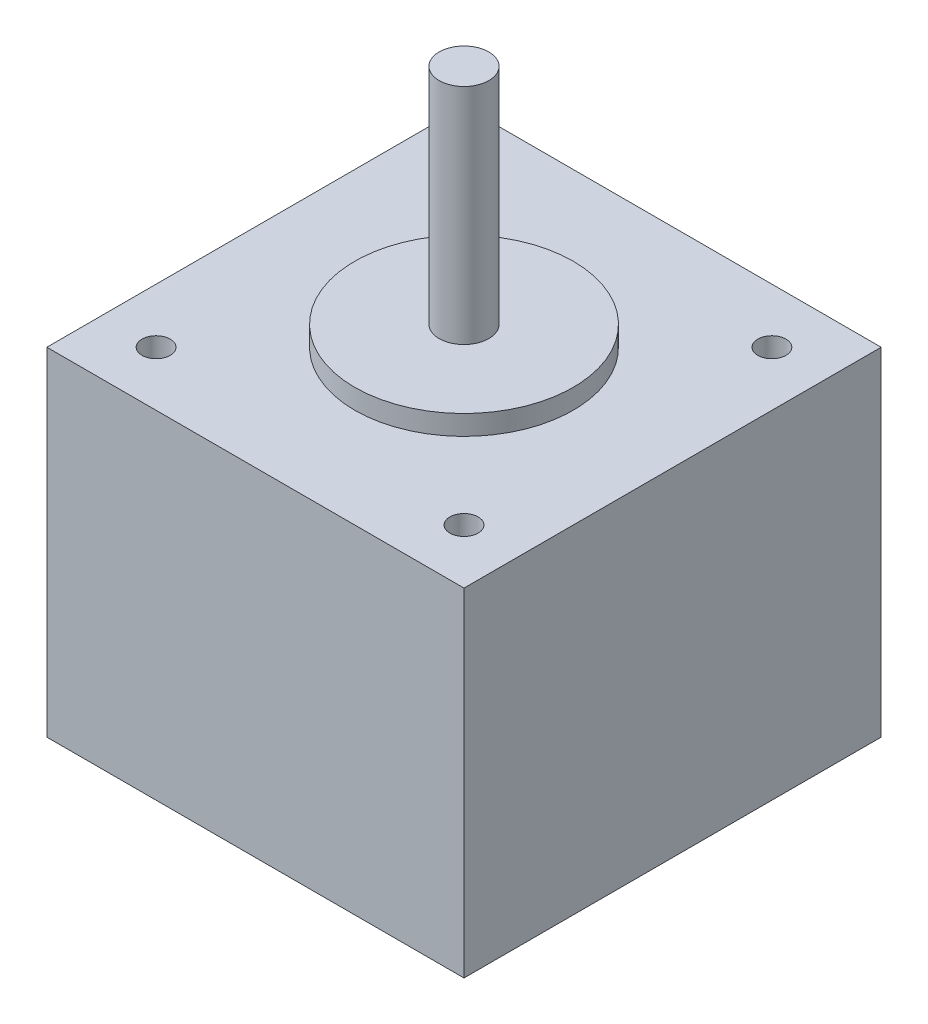
ISO-10303-21;
HEADER;
FILE_DESCRIPTION(('STEP AP214'),'2;1');
FILE_NAME('part.step','',(''),(''),'','','');
FILE_SCHEMA(('AUTOMOTIVE_DESIGN { 1 0 10303 214 1 1 1 1 }'));
ENDSEC;
DATA;
#1=APPLICATION_CONTEXT('core data for automotive mechanical design processes');
#2=APPLICATION_PROTOCOL_DEFINITION('international standard','automotive_design',2000,#1);
#3=PRODUCT_CONTEXT('',#1,'mechanical');
#4=PRODUCT('Part','Part','',(#3));
#5=PRODUCT_RELATED_PRODUCT_CATEGORY('part','',(#4));
#6=PRODUCT_DEFINITION_FORMATION('','',#4);
#7=PRODUCT_DEFINITION_CONTEXT('part definition',#1,'design');
#8=PRODUCT_DEFINITION('design','',#6,#7);
#9=PRODUCT_DEFINITION_SHAPE('','',#8);
#10=(LENGTH_UNIT() NAMED_UNIT(*) SI_UNIT(.MILLI.,.METRE.));
#11=(NAMED_UNIT(*) PLANE_ANGLE_UNIT() SI_UNIT($,.RADIAN.));
#12=(NAMED_UNIT(*) SI_UNIT($,.STERADIAN.) SOLID_ANGLE_UNIT());
#13=UNCERTAINTY_MEASURE_WITH_UNIT(LENGTH_MEASURE(1.E-05),#10,'distance_accuracy_value','');
#14=(GEOMETRIC_REPRESENTATION_CONTEXT(3) GLOBAL_UNCERTAINTY_ASSIGNED_CONTEXT((#13)) GLOBAL_UNIT_ASSIGNED_CONTEXT((#10,
#11,#12)) REPRESENTATION_CONTEXT('',''));
#15=CARTESIAN_POINT('',(0.,0.,0.));
#16=DIRECTION('',(0.,0.,1.));
#17=DIRECTION('',(1.,0.,0.));
#18=AXIS2_PLACEMENT_3D('',#15,#16,#17);
#19=CARTESIAN_POINT('',(21.,34.,21.));
#20=DIRECTION('',(-1.,0.,0.));
#21=DIRECTION('',(0.,0.,1.));
#22=AXIS2_PLACEMENT_3D('',#19,#20,#21);
#23=PLANE('',#22);
#24=DIRECTION('',(0.,0.,-1.));
#25=VECTOR('',#24,1.);
#26=CARTESIAN_POINT('',(21.,0.,21.));
#27=LINE('',#26,#25);
#28=CARTESIAN_POINT('',(21.,0.,21.));
#29=VERTEX_POINT('',#28);
#30=CARTESIAN_POINT('',(21.,0.,-21.));
#31=VERTEX_POINT('',#30);
#32=EDGE_CURVE('E105',#29,#31,#27,.T.);
#33=ORIENTED_EDGE('',*,*,#32,.T.);
#34=DIRECTION('',(0.,-1.,0.));
#35=VECTOR('',#34,1.);
#36=CARTESIAN_POINT('',(21.,34.,-21.));
#37=LINE('',#36,#35);
#38=CARTESIAN_POINT('',(21.,34.,-21.));
#39=VERTEX_POINT('',#38);
#40=EDGE_CURVE('E47',#39,#31,#37,.T.);
#41=ORIENTED_EDGE('',*,*,#40,.F.);
#42=DIRECTION('',(0.,0.,-1.));
#43=VECTOR('',#42,1.);
#44=CARTESIAN_POINT('',(21.,34.,21.));
#45=LINE('',#44,#43);
#46=CARTESIAN_POINT('',(21.,34.,21.));
#47=VERTEX_POINT('',#46);
#48=EDGE_CURVE('E91',#47,#39,#45,.T.);
#49=ORIENTED_EDGE('',*,*,#48,.F.);
#50=DIRECTION('',(0.,-1.,0.));
#51=VECTOR('',#50,1.);
#52=CARTESIAN_POINT('',(21.,34.,21.));
#53=LINE('',#52,#51);
#54=EDGE_CURVE('E101',#47,#29,#53,.T.);
#55=ORIENTED_EDGE('',*,*,#54,.T.);
#56=EDGE_LOOP('',(#33,#41,#49,#55));
#57=FACE_BOUND('',#56,.T.);
#58=ADVANCED_FACE('F39',(#57),#23,.F.);
#59=CARTESIAN_POINT('',(-21.,34.,-21.));
#60=DIRECTION('',(0.,0.,1.));
#61=DIRECTION('',(1.,0.,0.));
#62=AXIS2_PLACEMENT_3D('',#59,#60,#61);
#63=PLANE('',#62);
#64=DIRECTION('',(-1.,0.,0.));
#65=VECTOR('',#64,1.);
#66=CARTESIAN_POINT('',(-21.,0.,-21.));
#67=LINE('',#66,#65);
#68=CARTESIAN_POINT('',(-21.,0.,-21.));
#69=VERTEX_POINT('',#68);
#70=EDGE_CURVE('E96',#31,#69,#67,.T.);
#71=ORIENTED_EDGE('',*,*,#70,.T.);
#72=DIRECTION('',(0.,-1.,0.));
#73=VECTOR('',#72,1.);
#74=CARTESIAN_POINT('',(-21.,34.,-21.));
#75=LINE('',#74,#73);
#76=CARTESIAN_POINT('',(-21.,34.,-21.));
#77=VERTEX_POINT('',#76);
#78=EDGE_CURVE('E94',#77,#69,#75,.T.);
#79=ORIENTED_EDGE('',*,*,#78,.F.);
#80=DIRECTION('',(-1.,0.,0.));
#81=VECTOR('',#80,1.);
#82=CARTESIAN_POINT('',(-21.,34.,-21.));
#83=LINE('',#82,#81);
#84=EDGE_CURVE('E86',#39,#77,#83,.T.);
#85=ORIENTED_EDGE('',*,*,#84,.F.);
#86=ORIENTED_EDGE('',*,*,#40,.T.);
#87=EDGE_LOOP('',(#71,#79,#85,#86));
#88=FACE_BOUND('',#87,.T.);
#89=ADVANCED_FACE('F95',(#88),#63,.F.);
#90=CARTESIAN_POINT('',(-21.,34.,21.));
#91=DIRECTION('',(1.,0.,0.));
#92=DIRECTION('',(0.,0.,-1.));
#93=AXIS2_PLACEMENT_3D('',#90,#91,#92);
#94=PLANE('',#93);
#95=DIRECTION('',(0.,0.,1.));
#96=VECTOR('',#95,1.);
#97=CARTESIAN_POINT('',(-21.,0.,21.));
#98=LINE('',#97,#96);
#99=CARTESIAN_POINT('',(-21.,0.,21.));
#100=VERTEX_POINT('',#99);
#101=EDGE_CURVE('E72',#69,#100,#98,.T.);
#102=ORIENTED_EDGE('',*,*,#101,.T.);
#103=DIRECTION('',(0.,-1.,0.));
#104=VECTOR('',#103,1.);
#105=CARTESIAN_POINT('',(-21.,34.,21.));
#106=LINE('',#105,#104);
#107=CARTESIAN_POINT('',(-21.,34.,21.));
#108=VERTEX_POINT('',#107);
#109=EDGE_CURVE('E97',#108,#100,#106,.T.);
#110=ORIENTED_EDGE('',*,*,#109,.F.);
#111=DIRECTION('',(0.,0.,1.));
#112=VECTOR('',#111,1.);
#113=CARTESIAN_POINT('',(-21.,34.,21.));
#114=LINE('',#113,#112);
#115=EDGE_CURVE('E89',#77,#108,#114,.T.);
#116=ORIENTED_EDGE('',*,*,#115,.F.);
#117=ORIENTED_EDGE('',*,*,#78,.T.);
#118=EDGE_LOOP('',(#102,#110,#116,#117));
#119=FACE_BOUND('',#118,.T.);
#120=ADVANCED_FACE('F99',(#119),#94,.F.);
#121=CARTESIAN_POINT('',(-21.,34.,21.));
#122=DIRECTION('',(0.,0.,-1.));
#123=DIRECTION('',(-1.,0.,0.));
#124=AXIS2_PLACEMENT_3D('',#121,#122,#123);
#125=PLANE('',#124);
#126=DIRECTION('',(1.,0.,0.));
#127=VECTOR('',#126,1.);
#128=CARTESIAN_POINT('',(-21.,0.,21.));
#129=LINE('',#128,#127);
#130=EDGE_CURVE('E78',#100,#29,#129,.T.);
#131=ORIENTED_EDGE('',*,*,#130,.T.);
#132=ORIENTED_EDGE('',*,*,#54,.F.);
#133=DIRECTION('',(1.,0.,0.));
#134=VECTOR('',#133,1.);
#135=CARTESIAN_POINT('',(-21.,34.,21.));
#136=LINE('',#135,#134);
#137=EDGE_CURVE('E55',#108,#47,#136,.T.);
#138=ORIENTED_EDGE('',*,*,#137,.F.);
#139=ORIENTED_EDGE('',*,*,#109,.T.);
#140=EDGE_LOOP('',(#131,#132,#138,#139));
#141=FACE_BOUND('',#140,.T.);
#142=ADVANCED_FACE('F127',(#141),#125,.F.);
#143=CARTESIAN_POINT('',(0.,34.,0.));
#144=DIRECTION('',(0.,-1.,0.));
#145=DIRECTION('',(0.,0.,-1.));
#146=AXIS2_PLACEMENT_3D('',#143,#144,#145);
#147=PLANE('',#146);
#148=CARTESIAN_POINT('',(15.5,34.,-15.5));
#149=DIRECTION('',(0.,1.,0.));
#150=DIRECTION('',(0.,0.,1.));
#151=AXIS2_PLACEMENT_3D('',#148,#149,#150);
#152=CIRCLE('',#151,1.42);
#153=CARTESIAN_POINT('',(15.5,34.,-14.08));
#154=VERTEX_POINT('',#153);
#155=EDGE_CURVE('E282',#154,#154,#152,.T.);
#156=ORIENTED_EDGE('',*,*,#155,.F.);
#157=EDGE_LOOP('',(#156));
#158=FACE_BOUND('',#157,.T.);
#159=CARTESIAN_POINT('',(15.5000000000003,34.,15.5));
#160=DIRECTION('',(0.,1.,0.));
#161=DIRECTION('',(0.,0.,1.));
#162=AXIS2_PLACEMENT_3D('',#159,#160,#161);
#163=CIRCLE('',#162,1.42);
#164=CARTESIAN_POINT('',(15.5000000000003,34.,16.92));
#165=VERTEX_POINT('',#164);
#166=EDGE_CURVE('E276',#165,#165,#163,.T.);
#167=ORIENTED_EDGE('',*,*,#166,.F.);
#168=EDGE_LOOP('',(#167));
#169=FACE_BOUND('',#168,.T.);
#170=CARTESIAN_POINT('',(-15.4999999999997,34.,15.5));
#171=DIRECTION('',(0.,1.,0.));
#172=DIRECTION('',(0.,0.,1.));
#173=AXIS2_PLACEMENT_3D('',#170,#171,#172);
#174=CIRCLE('',#173,1.42);
#175=CARTESIAN_POINT('',(-15.4999999999997,34.,16.92));
#176=VERTEX_POINT('',#175);
#177=EDGE_CURVE('E270',#176,#176,#174,.T.);
#178=ORIENTED_EDGE('',*,*,#177,.F.);
#179=EDGE_LOOP('',(#178));
#180=FACE_BOUND('',#179,.T.);
#181=CARTESIAN_POINT('',(-15.5,34.,-15.5));
#182=DIRECTION('',(0.,1.,0.));
#183=DIRECTION('',(0.,0.,1.));
#184=AXIS2_PLACEMENT_3D('',#181,#182,#183);
#185=CIRCLE('',#184,1.42);
#186=CARTESIAN_POINT('',(-15.5,34.,-14.08));
#187=VERTEX_POINT('',#186);
#188=EDGE_CURVE('E264',#187,#187,#185,.T.);
#189=ORIENTED_EDGE('',*,*,#188,.F.);
#190=EDGE_LOOP('',(#189));
#191=FACE_BOUND('',#190,.T.);
#192=CARTESIAN_POINT('',(0.,34.,0.));
#193=DIRECTION('',(0.,-1.,0.));
#194=DIRECTION('',(0.,0.,-1.));
#195=AXIS2_PLACEMENT_3D('',#192,#193,#194);
#196=CIRCLE('',#195,11.);
#197=CARTESIAN_POINT('',(0.,34.,-11.));
#198=VERTEX_POINT('',#197);
#199=EDGE_CURVE('E11',#198,#198,#196,.F.);
#200=ORIENTED_EDGE('',*,*,#199,.F.);
#201=EDGE_LOOP('',(#200));
#202=FACE_BOUND('',#201,.T.);
#203=ORIENTED_EDGE('',*,*,#48,.T.);
#204=ORIENTED_EDGE('',*,*,#84,.T.);
#205=ORIENTED_EDGE('',*,*,#115,.T.);
#206=ORIENTED_EDGE('',*,*,#137,.T.);
#207=EDGE_LOOP('',(#203,#204,#205,#206));
#208=FACE_BOUND('',#207,.T.);
#209=ADVANCED_FACE('F87',(#158,#169,#180,#191,#202,#208),#147,.F.);
#210=CARTESIAN_POINT('',(0.,0.,0.));
#211=DIRECTION('',(0.,-1.,0.));
#212=DIRECTION('',(0.,0.,-1.));
#213=AXIS2_PLACEMENT_3D('',#210,#211,#212);
#214=PLANE('',#213);
#215=ORIENTED_EDGE('',*,*,#32,.F.);
#216=ORIENTED_EDGE('',*,*,#130,.F.);
#217=ORIENTED_EDGE('',*,*,#101,.F.);
#218=ORIENTED_EDGE('',*,*,#70,.F.);
#219=EDGE_LOOP('',(#215,#216,#217,#218));
#220=FACE_BOUND('',#219,.T.);
#221=ADVANCED_FACE('F116',(#220),#214,.T.);
#222=CARTESIAN_POINT('',(0.,36.,0.));
#223=DIRECTION('',(0.,-1.,0.));
#224=DIRECTION('',(0.,0.,-1.));
#225=AXIS2_PLACEMENT_3D('',#222,#223,#224);
#226=CYLINDRICAL_SURFACE('',#225,11.);
#227=CARTESIAN_POINT('',(0.,36.,0.));
#228=DIRECTION('',(0.,1.,0.));
#229=DIRECTION('',(0.,0.,1.));
#230=AXIS2_PLACEMENT_3D('',#227,#228,#229);
#231=CIRCLE('',#230,11.);
#232=CARTESIAN_POINT('',(0.,36.,11.));
#233=VERTEX_POINT('',#232);
#234=EDGE_CURVE('E108',#233,#233,#231,.T.);
#235=ORIENTED_EDGE('',*,*,#234,.F.);
#236=EDGE_LOOP('',(#235));
#237=FACE_BOUND('',#236,.T.);
#238=ORIENTED_EDGE('',*,*,#199,.T.);
#239=EDGE_LOOP('',(#238));
#240=FACE_BOUND('',#239,.T.);
#241=ADVANCED_FACE('F118',(#237,#240),#226,.T.);
#242=CARTESIAN_POINT('',(0.,36.,0.));
#243=DIRECTION('',(0.,1.,0.));
#244=DIRECTION('',(0.,0.,1.));
#245=AXIS2_PLACEMENT_3D('',#242,#243,#244);
#246=PLANE('',#245);
#247=CARTESIAN_POINT('',(0.,36.,0.));
#248=DIRECTION('',(0.,1.,0.));
#249=DIRECTION('',(0.,0.,1.));
#250=AXIS2_PLACEMENT_3D('',#247,#248,#249);
#251=CIRCLE('',#250,2.5);
#252=CARTESIAN_POINT('',(0.,36.,-2.5));
#253=VERTEX_POINT('',#252);
#254=EDGE_CURVE('E254',#253,#253,#251,.T.);
#255=ORIENTED_EDGE('',*,*,#254,.F.);
#256=EDGE_LOOP('',(#255));
#257=FACE_BOUND('',#256,.T.);
#258=ORIENTED_EDGE('',*,*,#234,.T.);
#259=EDGE_LOOP('',(#258));
#260=FACE_BOUND('',#259,.T.);
#261=ADVANCED_FACE('F124',(#257,#260),#246,.T.);
#262=CARTESIAN_POINT('',(0.,58.5,0.));
#263=DIRECTION('',(0.,-1.,0.));
#264=DIRECTION('',(0.,0.,-1.));
#265=AXIS2_PLACEMENT_3D('',#262,#263,#264);
#266=CYLINDRICAL_SURFACE('',#265,2.5);
#267=CARTESIAN_POINT('',(0.,58.5,0.));
#268=DIRECTION('',(0.,1.,0.));
#269=DIRECTION('',(0.,0.,1.));
#270=AXIS2_PLACEMENT_3D('',#267,#268,#269);
#271=CIRCLE('',#270,2.5);
#272=CARTESIAN_POINT('',(0.,58.5,-2.5));
#273=VERTEX_POINT('',#272);
#274=EDGE_CURVE('E257',#273,#273,#271,.T.);
#275=CARTESIAN_POINT('',(0.,58.5,-2.5));
#276=CARTESIAN_POINT('',(0.,58.265625,-2.5));
#277=CARTESIAN_POINT('',(0.,58.03125,-2.5));
#278=CARTESIAN_POINT('',(0.,57.5625,-2.5));
#279=CARTESIAN_POINT('',(0.,57.328125,-2.5));
#280=CARTESIAN_POINT('',(0.,56.859375,-2.5));
#281=CARTESIAN_POINT('',(0.,56.625,-2.5));
#282=CARTESIAN_POINT('',(0.,56.15625,-2.5));
#283=CARTESIAN_POINT('',(0.,55.921875,-2.5));
#284=CARTESIAN_POINT('',(0.,55.453125,-2.5));
#285=CARTESIAN_POINT('',(0.,55.21875,-2.5));
#286=CARTESIAN_POINT('',(0.,54.75,-2.5));
#287=CARTESIAN_POINT('',(0.,54.515625,-2.5));
#288=CARTESIAN_POINT('',(0.,54.046875,-2.5));
#289=CARTESIAN_POINT('',(0.,53.8125,-2.5));
#290=CARTESIAN_POINT('',(0.,53.34375,-2.5));
#291=CARTESIAN_POINT('',(0.,53.109375,-2.5));
#292=CARTESIAN_POINT('',(0.,52.640625,-2.5));
#293=CARTESIAN_POINT('',(0.,52.40625,-2.5));
#294=CARTESIAN_POINT('',(0.,51.9375,-2.5));
#295=CARTESIAN_POINT('',(0.,51.703125,-2.5));
#296=CARTESIAN_POINT('',(0.,51.234375,-2.5));
#297=CARTESIAN_POINT('',(0.,51.,-2.5));
#298=CARTESIAN_POINT('',(0.,50.53125,-2.5));
#299=CARTESIAN_POINT('',(0.,50.296875,-2.5));
#300=CARTESIAN_POINT('',(0.,49.828125,-2.5));
#301=CARTESIAN_POINT('',(0.,49.59375,-2.5));
#302=CARTESIAN_POINT('',(0.,49.125,-2.5));
#303=CARTESIAN_POINT('',(0.,48.890625,-2.5));
#304=CARTESIAN_POINT('',(0.,48.421875,-2.5));
#305=CARTESIAN_POINT('',(0.,48.1875,-2.5));
#306=CARTESIAN_POINT('',(0.,47.71875,-2.5));
#307=CARTESIAN_POINT('',(0.,47.484375,-2.5));
#308=CARTESIAN_POINT('',(0.,47.015625,-2.5));
#309=CARTESIAN_POINT('',(0.,46.78125,-2.5));
#310=CARTESIAN_POINT('',(0.,46.3125,-2.5));
#311=CARTESIAN_POINT('',(0.,46.078125,-2.5));
#312=CARTESIAN_POINT('',(0.,45.609375,-2.5));
#313=CARTESIAN_POINT('',(0.,45.375,-2.5));
#314=CARTESIAN_POINT('',(0.,44.90625,-2.5));
#315=CARTESIAN_POINT('',(0.,44.671875,-2.5));
#316=CARTESIAN_POINT('',(0.,44.203125,-2.5));
#317=CARTESIAN_POINT('',(0.,43.96875,-2.5));
#318=CARTESIAN_POINT('',(0.,43.5,-2.5));
#319=CARTESIAN_POINT('',(0.,43.265625,-2.5));
#320=CARTESIAN_POINT('',(0.,42.796875,-2.5));
#321=CARTESIAN_POINT('',(0.,42.5625,-2.5));
#322=CARTESIAN_POINT('',(0.,42.09375,-2.5));
#323=CARTESIAN_POINT('',(0.,41.859375,-2.5));
#324=CARTESIAN_POINT('',(0.,41.390625,-2.5));
#325=CARTESIAN_POINT('',(0.,41.15625,-2.5));
#326=CARTESIAN_POINT('',(0.,40.6875,-2.5));
#327=CARTESIAN_POINT('',(0.,40.453125,-2.5));
#328=CARTESIAN_POINT('',(0.,39.984375,-2.5));
#329=CARTESIAN_POINT('',(0.,39.75,-2.5));
#330=CARTESIAN_POINT('',(0.,39.28125,-2.5));
#331=CARTESIAN_POINT('',(0.,39.046875,-2.5));
#332=CARTESIAN_POINT('',(0.,38.578125,-2.5));
#333=CARTESIAN_POINT('',(0.,38.34375,-2.5));
#334=CARTESIAN_POINT('',(0.,37.875,-2.5));
#335=CARTESIAN_POINT('',(0.,37.640625,-2.5));
#336=CARTESIAN_POINT('',(0.,37.171875,-2.5));
#337=CARTESIAN_POINT('',(0.,36.9375,-2.5));
#338=CARTESIAN_POINT('',(0.,36.46875,-2.5));
#339=CARTESIAN_POINT('',(0.,36.234375,-2.5));
#340=CARTESIAN_POINT('',(0.,36.,-2.5));
#341=B_SPLINE_CURVE_WITH_KNOTS('',3,(#275,#276,#277,#278,#279,#280,#281,#282,#283,#284,#285,
#286,#287,#288,#289,#290,#291,#292,#293,#294,#295,#296,#297,#298,#299,#300,#301,#302,#303,#304,
#305,#306,#307,#308,#309,#310,#311,#312,#313,#314,#315,#316,#317,#318,#319,#320,#321,#322,#323,
#324,#325,#326,#327,#328,#329,#330,#331,#332,#333,#334,#335,#336,#337,#338,#339,#340),
.UNSPECIFIED.,.F.,.F.,(4,2,2,2,2,2,2,2,2,2,2,2,2,2,2,2,2,2,2,2,2,2,2,2,2,2,2,2,2,2,2,2,4),(0.,
0.703124999999999,1.40625,2.109375,2.8125,3.51562499999999,4.21874999999999,4.921875,5.625,
6.328125,7.03125,7.73437499999999,8.43749999999999,9.140625,9.84375,10.546875,11.25,11.953125,
12.65625,13.359375,14.0625,14.765625,15.46875,16.171875,16.875,17.578125,18.28125,18.984375,
19.6875,20.390625,21.09375,21.796875,22.5),.UNSPECIFIED.);
#342=EDGE_CURVE('BSEAM242',#273,#253,#341,.T.);
#343=ORIENTED_EDGE('',*,*,#274,.F.);
#344=ORIENTED_EDGE('',*,*,#254,.T.);
#345=ORIENTED_EDGE('',*,*,#342,.T.);
#346=ORIENTED_EDGE('',*,*,#342,.F.);
#347=EDGE_LOOP('',(#343,#345,#344,#346));
#348=FACE_BOUND('',#347,.T.);
#349=ADVANCED_FACE('F242',(#348),#266,.T.);
#350=CARTESIAN_POINT('',(0.,58.5,0.));
#351=DIRECTION('',(0.,1.,0.));
#352=DIRECTION('',(0.,0.,1.));
#353=AXIS2_PLACEMENT_3D('',#350,#351,#352);
#354=PLANE('',#353);
#355=ORIENTED_EDGE('',*,*,#274,.T.);
#356=EDGE_LOOP('',(#355));
#357=FACE_BOUND('',#356,.T.);
#358=ADVANCED_FACE('F155',(#357),#354,.T.);
#359=CARTESIAN_POINT('',(-15.5,29.,-15.5));
#360=DIRECTION('',(0.,1.,0.));
#361=DIRECTION('',(0.,0.,1.));
#362=AXIS2_PLACEMENT_3D('',#359,#360,#361);
#363=CYLINDRICAL_SURFACE('',#362,1.42);
#364=CARTESIAN_POINT('',(-15.5,29.,-15.5));
#365=DIRECTION('',(0.,1.,0.));
#366=DIRECTION('',(0.,0.,1.));
#367=AXIS2_PLACEMENT_3D('',#364,#365,#366);
#368=CIRCLE('',#367,1.42);
#369=CARTESIAN_POINT('',(-15.5,29.,-14.08));
#370=VERTEX_POINT('',#369);
#371=EDGE_CURVE('E262',#370,#370,#368,.T.);
#372=ORIENTED_EDGE('',*,*,#371,.F.);
#373=EDGE_LOOP('',(#372));
#374=FACE_BOUND('',#373,.T.);
#375=ORIENTED_EDGE('',*,*,#188,.T.);
#376=EDGE_LOOP('',(#375));
#377=FACE_BOUND('',#376,.T.);
#378=ADVANCED_FACE('F160',(#374,#377),#363,.F.);
#379=CARTESIAN_POINT('',(-15.5,29.,-15.5));
#380=DIRECTION('',(0.,1.,0.));
#381=DIRECTION('',(0.,0.,1.));
#382=AXIS2_PLACEMENT_3D('',#379,#380,#381);
#383=PLANE('',#382);
#384=ORIENTED_EDGE('',*,*,#371,.T.);
#385=EDGE_LOOP('',(#384));
#386=FACE_BOUND('',#385,.T.);
#387=ADVANCED_FACE('F165',(#386),#383,.T.);
#388=CARTESIAN_POINT('',(-15.4999999999997,29.,15.5));
#389=DIRECTION('',(0.,1.,0.));
#390=DIRECTION('',(0.,0.,1.));
#391=AXIS2_PLACEMENT_3D('',#388,#389,#390);
#392=CYLINDRICAL_SURFACE('',#391,1.42);
#393=CARTESIAN_POINT('',(-15.4999999999997,29.,15.5));
#394=DIRECTION('',(0.,1.,0.));
#395=DIRECTION('',(0.,0.,1.));
#396=AXIS2_PLACEMENT_3D('',#393,#394,#395);
#397=CIRCLE('',#396,1.42);
#398=CARTESIAN_POINT('',(-15.4999999999997,29.,16.92));
#399=VERTEX_POINT('',#398);
#400=EDGE_CURVE('E273',#399,#399,#397,.T.);
#401=ORIENTED_EDGE('',*,*,#400,.F.);
#402=EDGE_LOOP('',(#401));
#403=FACE_BOUND('',#402,.T.);
#404=ORIENTED_EDGE('',*,*,#177,.T.);
#405=EDGE_LOOP('',(#404));
#406=FACE_BOUND('',#405,.T.);
#407=ADVANCED_FACE('F175',(#403,#406),#392,.F.);
#408=CARTESIAN_POINT('',(-15.4999999999997,29.,15.5));
#409=DIRECTION('',(0.,1.,0.));
#410=DIRECTION('',(0.,0.,1.));
#411=AXIS2_PLACEMENT_3D('',#408,#409,#410);
#412=PLANE('',#411);
#413=ORIENTED_EDGE('',*,*,#400,.T.);
#414=EDGE_LOOP('',(#413));
#415=FACE_BOUND('',#414,.T.);
#416=ADVANCED_FACE('F185',(#415),#412,.T.);
#417=CARTESIAN_POINT('',(15.5000000000003,29.,15.5));
#418=DIRECTION('',(0.,1.,0.));
#419=DIRECTION('',(0.,0.,1.));
#420=AXIS2_PLACEMENT_3D('',#417,#418,#419);
#421=CYLINDRICAL_SURFACE('',#420,1.42);
#422=CARTESIAN_POINT('',(15.5000000000003,29.,15.5));
#423=DIRECTION('',(0.,1.,0.));
#424=DIRECTION('',(0.,0.,1.));
#425=AXIS2_PLACEMENT_3D('',#422,#423,#424);
#426=CIRCLE('',#425,1.42);
#427=CARTESIAN_POINT('',(15.5000000000003,29.,16.92));
#428=VERTEX_POINT('',#427);
#429=EDGE_CURVE('E279',#428,#428,#426,.T.);
#430=ORIENTED_EDGE('',*,*,#429,.F.);
#431=EDGE_LOOP('',(#430));
#432=FACE_BOUND('',#431,.T.);
#433=ORIENTED_EDGE('',*,*,#166,.T.);
#434=EDGE_LOOP('',(#433));
#435=FACE_BOUND('',#434,.T.);
#436=ADVANCED_FACE('F195',(#432,#435),#421,.F.);
#437=CARTESIAN_POINT('',(15.5000000000003,29.,15.5));
#438=DIRECTION('',(0.,1.,0.));
#439=DIRECTION('',(0.,0.,1.));
#440=AXIS2_PLACEMENT_3D('',#437,#438,#439);
#441=PLANE('',#440);
#442=ORIENTED_EDGE('',*,*,#429,.T.);
#443=EDGE_LOOP('',(#442));
#444=FACE_BOUND('',#443,.T.);
#445=ADVANCED_FACE('F205',(#444),#441,.T.);
#446=CARTESIAN_POINT('',(15.5,29.,-15.5));
#447=DIRECTION('',(0.,1.,0.));
#448=DIRECTION('',(0.,0.,1.));
#449=AXIS2_PLACEMENT_3D('',#446,#447,#448);
#450=CYLINDRICAL_SURFACE('',#449,1.42);
#451=CARTESIAN_POINT('',(15.5,29.,-15.5));
#452=DIRECTION('',(0.,1.,0.));
#453=DIRECTION('',(0.,0.,1.));
#454=AXIS2_PLACEMENT_3D('',#451,#452,#453);
#455=CIRCLE('',#454,1.42);
#456=CARTESIAN_POINT('',(15.5,29.,-14.08));
#457=VERTEX_POINT('',#456);
#458=EDGE_CURVE('E267',#457,#457,#455,.T.);
#459=ORIENTED_EDGE('',*,*,#458,.F.);
#460=EDGE_LOOP('',(#459));
#461=FACE_BOUND('',#460,.T.);
#462=ORIENTED_EDGE('',*,*,#155,.T.);
#463=EDGE_LOOP('',(#462));
#464=FACE_BOUND('',#463,.T.);
#465=ADVANCED_FACE('F215',(#461,#464),#450,.F.);
#466=CARTESIAN_POINT('',(15.5,29.,-15.5));
#467=DIRECTION('',(0.,1.,0.));
#468=DIRECTION('',(0.,0.,1.));
#469=AXIS2_PLACEMENT_3D('',#466,#467,#468);
#470=PLANE('',#469);
#471=ORIENTED_EDGE('',*,*,#458,.T.);
#472=EDGE_LOOP('',(#471));
#473=FACE_BOUND('',#472,.T.);
#474=ADVANCED_FACE('F225',(#473),#470,.T.);
#475=CLOSED_SHELL('',(#58,#89,#120,#142,#209,#221,#241,#261,#349,#358,#378,#387,#407,#416,#436,
#445,#465,#474));
#476=MANIFOLD_SOLID_BREP('B2',#475);
#477=ADVANCED_BREP_SHAPE_REPRESENTATION('',(#18,#476),#14);
#478=SHAPE_DEFINITION_REPRESENTATION(#9,#477);
ENDSEC;
END-ISO-10303-21;
